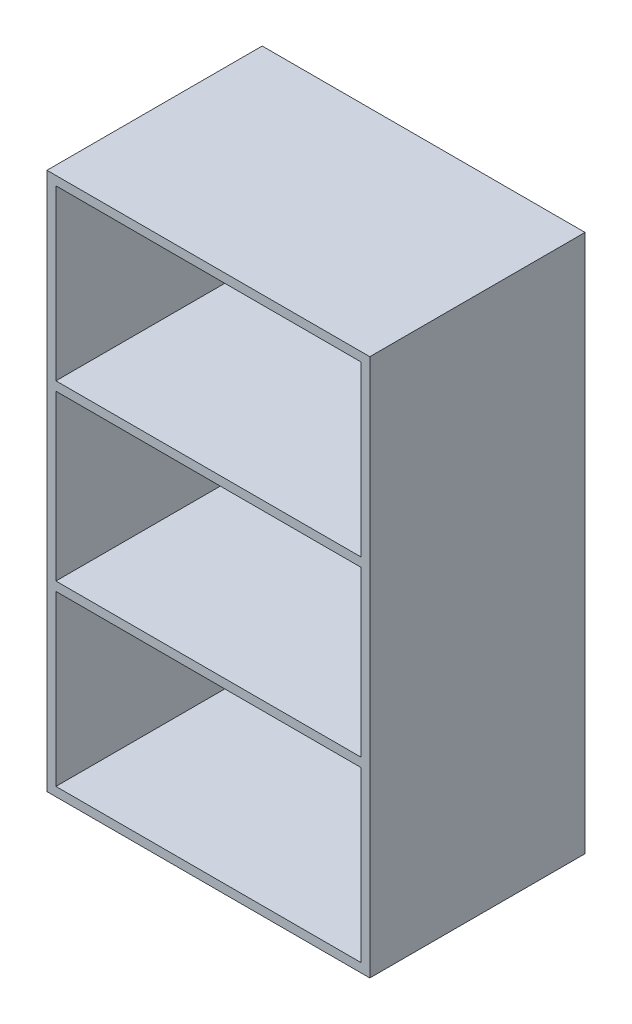
ISO-10303-21;
HEADER;
FILE_DESCRIPTION(('STEP AP214'),'2;1');
FILE_NAME('part.step','',(''),(''),'','','');
FILE_SCHEMA(('AUTOMOTIVE_DESIGN { 1 0 10303 214 1 1 1 1 }'));
ENDSEC;
DATA;
#1=APPLICATION_CONTEXT('core data for automotive mechanical design processes');
#2=APPLICATION_PROTOCOL_DEFINITION('international standard','automotive_design',2000,#1);
#3=PRODUCT_CONTEXT('',#1,'mechanical');
#4=PRODUCT('Part','Part','',(#3));
#5=PRODUCT_RELATED_PRODUCT_CATEGORY('part','',(#4));
#6=PRODUCT_DEFINITION_FORMATION('','',#4);
#7=PRODUCT_DEFINITION_CONTEXT('part definition',#1,'design');
#8=PRODUCT_DEFINITION('design','',#6,#7);
#9=PRODUCT_DEFINITION_SHAPE('','',#8);
#10=(LENGTH_UNIT() NAMED_UNIT(*) SI_UNIT(.MILLI.,.METRE.));
#11=(NAMED_UNIT(*) PLANE_ANGLE_UNIT() SI_UNIT($,.RADIAN.));
#12=(NAMED_UNIT(*) SI_UNIT($,.STERADIAN.) SOLID_ANGLE_UNIT());
#13=UNCERTAINTY_MEASURE_WITH_UNIT(LENGTH_MEASURE(1.E-05),#10,'distance_accuracy_value','');
#14=(GEOMETRIC_REPRESENTATION_CONTEXT(3) GLOBAL_UNCERTAINTY_ASSIGNED_CONTEXT((#13)) GLOBAL_UNIT_ASSIGNED_CONTEXT((#10,
#11,#12)) REPRESENTATION_CONTEXT('',''));
#15=CARTESIAN_POINT('',(0.,0.,0.));
#16=DIRECTION('',(0.,0.,1.));
#17=DIRECTION('',(1.,0.,0.));
#18=AXIS2_PLACEMENT_3D('',#15,#16,#17);
#19=CARTESIAN_POINT('',(457.2,1524.,-304.8));
#20=DIRECTION('',(-1.,0.,0.));
#21=DIRECTION('',(0.,0.,1.));
#22=AXIS2_PLACEMENT_3D('',#19,#20,#21);
#23=PLANE('',#22);
#24=DIRECTION('',(0.,0.,-1.));
#25=VECTOR('',#24,1.);
#26=CARTESIAN_POINT('',(457.2,0.,-304.8));
#27=LINE('',#26,#25);
#28=CARTESIAN_POINT('',(457.2,0.,304.8));
#29=VERTEX_POINT('',#28);
#30=CARTESIAN_POINT('',(457.2,0.,-304.8));
#31=VERTEX_POINT('',#30);
#32=EDGE_CURVE('E182',#29,#31,#27,.T.);
#33=ORIENTED_EDGE('',*,*,#32,.T.);
#34=DIRECTION('',(0.,-1.,0.));
#35=VECTOR('',#34,1.);
#36=CARTESIAN_POINT('',(457.2,1524.,-304.8));
#37=LINE('',#36,#35);
#38=CARTESIAN_POINT('',(457.2,1524.,-304.8));
#39=VERTEX_POINT('',#38);
#40=EDGE_CURVE('E11',#39,#31,#37,.T.);
#41=ORIENTED_EDGE('',*,*,#40,.F.);
#42=DIRECTION('',(0.,0.,-1.));
#43=VECTOR('',#42,1.);
#44=CARTESIAN_POINT('',(457.2,1524.,-304.8));
#45=LINE('',#44,#43);
#46=CARTESIAN_POINT('',(457.2,1524.,304.8));
#47=VERTEX_POINT('',#46);
#48=EDGE_CURVE('E247',#47,#39,#45,.T.);
#49=ORIENTED_EDGE('',*,*,#48,.F.);
#50=DIRECTION('',(0.,-1.,0.));
#51=VECTOR('',#50,1.);
#52=CARTESIAN_POINT('',(457.2,1524.,304.8));
#53=LINE('',#52,#51);
#54=EDGE_CURVE('E257',#47,#29,#53,.T.);
#55=ORIENTED_EDGE('',*,*,#54,.T.);
#56=EDGE_LOOP('',(#33,#41,#49,#55));
#57=FACE_BOUND('',#56,.T.);
#58=ADVANCED_FACE('F32',(#57),#23,.F.);
#59=CARTESIAN_POINT('',(-457.2,1524.,-304.8));
#60=DIRECTION('',(0.,0.,1.));
#61=DIRECTION('',(1.,0.,0.));
#62=AXIS2_PLACEMENT_3D('',#59,#60,#61);
#63=PLANE('',#62);
#64=DIRECTION('',(-1.,0.,0.));
#65=VECTOR('',#64,1.);
#66=CARTESIAN_POINT('',(-431.8,503.766666666667,-304.8));
#67=LINE('',#66,#65);
#68=CARTESIAN_POINT('',(431.8,503.766666666667,-304.8));
#69=VERTEX_POINT('',#68);
#70=CARTESIAN_POINT('',(-431.8,503.766666666667,-304.8));
#71=VERTEX_POINT('',#70);
#72=EDGE_CURVE('E156',#69,#71,#67,.T.);
#73=ORIENTED_EDGE('',*,*,#72,.T.);
#74=DIRECTION('',(0.,-1.,0.));
#75=VECTOR('',#74,1.);
#76=CARTESIAN_POINT('',(-431.8,503.766666666667,-304.8));
#77=LINE('',#76,#75);
#78=CARTESIAN_POINT('',(-431.8,25.4,-304.8));
#79=VERTEX_POINT('',#78);
#80=EDGE_CURVE('E148',#71,#79,#77,.T.);
#81=ORIENTED_EDGE('',*,*,#80,.T.);
#82=DIRECTION('',(1.,0.,0.));
#83=VECTOR('',#82,1.);
#84=CARTESIAN_POINT('',(-431.8,25.4,-304.8));
#85=LINE('',#84,#83);
#86=CARTESIAN_POINT('',(431.8,25.4000000000001,-304.8));
#87=VERTEX_POINT('',#86);
#88=EDGE_CURVE('E159',#79,#87,#85,.T.);
#89=ORIENTED_EDGE('',*,*,#88,.T.);
#90=DIRECTION('',(0.,1.,0.));
#91=VECTOR('',#90,1.);
#92=CARTESIAN_POINT('',(431.8,25.4000000000001,-304.8));
#93=LINE('',#92,#91);
#94=EDGE_CURVE('E46',#87,#69,#93,.T.);
#95=ORIENTED_EDGE('',*,*,#94,.T.);
#96=EDGE_LOOP('',(#73,#81,#89,#95));
#97=FACE_BOUND('',#96,.T.);
#98=DIRECTION('',(1.,0.,0.));
#99=VECTOR('',#98,1.);
#100=CARTESIAN_POINT('',(-431.8,1020.23333333333,-304.8));
#101=LINE('',#100,#99);
#102=CARTESIAN_POINT('',(-431.8,1020.23333333333,-304.8));
#103=VERTEX_POINT('',#102);
#104=CARTESIAN_POINT('',(431.8,1020.23333333333,-304.8));
#105=VERTEX_POINT('',#104);
#106=EDGE_CURVE('E194',#103,#105,#101,.T.);
#107=ORIENTED_EDGE('',*,*,#106,.T.);
#108=DIRECTION('',(0.,1.,0.));
#109=VECTOR('',#108,1.);
#110=CARTESIAN_POINT('',(431.8,1020.23333333333,-304.8));
#111=LINE('',#110,#109);
#112=CARTESIAN_POINT('',(431.8,1498.6,-304.8));
#113=VERTEX_POINT('',#112);
#114=EDGE_CURVE('E186',#105,#113,#111,.T.);
#115=ORIENTED_EDGE('',*,*,#114,.T.);
#116=DIRECTION('',(-1.,0.,0.));
#117=VECTOR('',#116,1.);
#118=CARTESIAN_POINT('',(431.8,1498.6,-304.8));
#119=LINE('',#118,#117);
#120=CARTESIAN_POINT('',(-431.8,1498.6,-304.8));
#121=VERTEX_POINT('',#120);
#122=EDGE_CURVE('E189',#113,#121,#119,.T.);
#123=ORIENTED_EDGE('',*,*,#122,.T.);
#124=DIRECTION('',(0.,-1.,0.));
#125=VECTOR('',#124,1.);
#126=CARTESIAN_POINT('',(-431.8,1498.6,-304.8));
#127=LINE('',#126,#125);
#128=EDGE_CURVE('E54',#121,#103,#127,.T.);
#129=ORIENTED_EDGE('',*,*,#128,.T.);
#130=EDGE_LOOP('',(#107,#115,#123,#129));
#131=FACE_BOUND('',#130,.T.);
#132=DIRECTION('',(-1.,0.,0.));
#133=VECTOR('',#132,1.);
#134=CARTESIAN_POINT('',(-431.8,994.833333333333,-304.8));
#135=LINE('',#134,#133);
#136=CARTESIAN_POINT('',(431.8,994.833333333333,-304.8));
#137=VERTEX_POINT('',#136);
#138=CARTESIAN_POINT('',(-431.8,994.833333333333,-304.8));
#139=VERTEX_POINT('',#138);
#140=EDGE_CURVE('E226',#137,#139,#135,.T.);
#141=ORIENTED_EDGE('',*,*,#140,.T.);
#142=DIRECTION('',(0.,-1.,0.));
#143=VECTOR('',#142,1.);
#144=CARTESIAN_POINT('',(-431.8,994.833333333333,-304.8));
#145=LINE('',#144,#143);
#146=CARTESIAN_POINT('',(-431.8,529.166666666667,-304.8));
#147=VERTEX_POINT('',#146);
#148=EDGE_CURVE('E216',#139,#147,#145,.T.);
#149=ORIENTED_EDGE('',*,*,#148,.T.);
#150=DIRECTION('',(1.,0.,0.));
#151=VECTOR('',#150,1.);
#152=CARTESIAN_POINT('',(-431.8,529.166666666667,-304.8));
#153=LINE('',#152,#151);
#154=CARTESIAN_POINT('',(431.8,529.166666666667,-304.8));
#155=VERTEX_POINT('',#154);
#156=EDGE_CURVE('E219',#147,#155,#153,.T.);
#157=ORIENTED_EDGE('',*,*,#156,.T.);
#158=DIRECTION('',(0.,1.,0.));
#159=VECTOR('',#158,1.);
#160=CARTESIAN_POINT('',(431.8,529.166666666667,-304.8));
#161=LINE('',#160,#159);
#162=EDGE_CURVE('E223',#155,#137,#161,.T.);
#163=ORIENTED_EDGE('',*,*,#162,.T.);
#164=EDGE_LOOP('',(#141,#149,#157,#163));
#165=FACE_BOUND('',#164,.T.);
#166=DIRECTION('',(-1.,0.,0.));
#167=VECTOR('',#166,1.);
#168=CARTESIAN_POINT('',(-457.2,0.,-304.8));
#169=LINE('',#168,#167);
#170=CARTESIAN_POINT('',(-457.2,0.,-304.8));
#171=VERTEX_POINT('',#170);
#172=EDGE_CURVE('E260',#31,#171,#169,.T.);
#173=ORIENTED_EDGE('',*,*,#172,.T.);
#174=DIRECTION('',(0.,-1.,0.));
#175=VECTOR('',#174,1.);
#176=CARTESIAN_POINT('',(-457.2,1524.,-304.8));
#177=LINE('',#176,#175);
#178=CARTESIAN_POINT('',(-457.2,1524.,-304.8));
#179=VERTEX_POINT('',#178);
#180=EDGE_CURVE('E39',#179,#171,#177,.T.);
#181=ORIENTED_EDGE('',*,*,#180,.F.);
#182=DIRECTION('',(-1.,0.,0.));
#183=VECTOR('',#182,1.);
#184=CARTESIAN_POINT('',(-457.2,1524.,-304.8));
#185=LINE('',#184,#183);
#186=EDGE_CURVE('E250',#39,#179,#185,.T.);
#187=ORIENTED_EDGE('',*,*,#186,.F.);
#188=ORIENTED_EDGE('',*,*,#40,.T.);
#189=EDGE_LOOP('',(#173,#181,#187,#188));
#190=FACE_BOUND('',#189,.T.);
#191=ADVANCED_FACE('F163',(#97,#131,#165,#190),#63,.F.);
#192=CARTESIAN_POINT('',(-457.2,1524.,-304.8));
#193=DIRECTION('',(1.,0.,0.));
#194=DIRECTION('',(0.,0.,-1.));
#195=AXIS2_PLACEMENT_3D('',#192,#193,#194);
#196=PLANE('',#195);
#197=DIRECTION('',(0.,0.,1.));
#198=VECTOR('',#197,1.);
#199=CARTESIAN_POINT('',(-457.2,0.,-304.8));
#200=LINE('',#199,#198);
#201=CARTESIAN_POINT('',(-457.2,0.,304.8));
#202=VERTEX_POINT('',#201);
#203=EDGE_CURVE('E262',#171,#202,#200,.T.);
#204=ORIENTED_EDGE('',*,*,#203,.T.);
#205=DIRECTION('',(0.,-1.,0.));
#206=VECTOR('',#205,1.);
#207=CARTESIAN_POINT('',(-457.2,1524.,304.8));
#208=LINE('',#207,#206);
#209=CARTESIAN_POINT('',(-457.2,1524.,304.8));
#210=VERTEX_POINT('',#209);
#211=EDGE_CURVE('E267',#210,#202,#208,.T.);
#212=ORIENTED_EDGE('',*,*,#211,.F.);
#213=DIRECTION('',(0.,0.,1.));
#214=VECTOR('',#213,1.);
#215=CARTESIAN_POINT('',(-457.2,1524.,-304.8));
#216=LINE('',#215,#214);
#217=EDGE_CURVE('E253',#179,#210,#216,.T.);
#218=ORIENTED_EDGE('',*,*,#217,.F.);
#219=ORIENTED_EDGE('',*,*,#180,.T.);
#220=EDGE_LOOP('',(#204,#212,#218,#219));
#221=FACE_BOUND('',#220,.T.);
#222=ADVANCED_FACE('F274',(#221),#196,.F.);
#223=CARTESIAN_POINT('',(-457.2,1524.,304.8));
#224=DIRECTION('',(0.,0.,-1.));
#225=DIRECTION('',(-1.,0.,0.));
#226=AXIS2_PLACEMENT_3D('',#223,#224,#225);
#227=PLANE('',#226);
#228=DIRECTION('',(1.,0.,0.));
#229=VECTOR('',#228,1.);
#230=CARTESIAN_POINT('',(-431.8,25.4,304.8));
#231=LINE('',#230,#229);
#232=CARTESIAN_POINT('',(-431.8,25.4000000000001,304.8));
#233=VERTEX_POINT('',#232);
#234=CARTESIAN_POINT('',(431.8,25.4000000000001,304.8));
#235=VERTEX_POINT('',#234);
#236=EDGE_CURVE('E175',#233,#235,#231,.T.);
#237=ORIENTED_EDGE('',*,*,#236,.F.);
#238=DIRECTION('',(0.,-1.,0.));
#239=VECTOR('',#238,1.);
#240=CARTESIAN_POINT('',(-431.8,503.766666666667,304.8));
#241=LINE('',#240,#239);
#242=CARTESIAN_POINT('',(-431.8,503.766666666667,304.8));
#243=VERTEX_POINT('',#242);
#244=EDGE_CURVE('E151',#243,#233,#241,.T.);
#245=ORIENTED_EDGE('',*,*,#244,.F.);
#246=DIRECTION('',(-1.,0.,0.));
#247=VECTOR('',#246,1.);
#248=CARTESIAN_POINT('',(-431.8,503.766666666667,304.8));
#249=LINE('',#248,#247);
#250=CARTESIAN_POINT('',(431.8,503.766666666667,304.8));
#251=VERTEX_POINT('',#250);
#252=EDGE_CURVE('E166',#251,#243,#249,.T.);
#253=ORIENTED_EDGE('',*,*,#252,.F.);
#254=DIRECTION('',(0.,1.,0.));
#255=VECTOR('',#254,1.);
#256=CARTESIAN_POINT('',(431.8,25.4000000000001,304.8));
#257=LINE('',#256,#255);
#258=EDGE_CURVE('E169',#235,#251,#257,.T.);
#259=ORIENTED_EDGE('',*,*,#258,.F.);
#260=EDGE_LOOP('',(#237,#245,#253,#259));
#261=FACE_BOUND('',#260,.T.);
#262=DIRECTION('',(-1.,0.,0.));
#263=VECTOR('',#262,1.);
#264=CARTESIAN_POINT('',(431.8,1498.6,304.8));
#265=LINE('',#264,#263);
#266=CARTESIAN_POINT('',(431.8,1498.6,304.8));
#267=VERTEX_POINT('',#266);
#268=CARTESIAN_POINT('',(-431.8,1498.6,304.8));
#269=VERTEX_POINT('',#268);
#270=EDGE_CURVE('E200',#267,#269,#265,.T.);
#271=ORIENTED_EDGE('',*,*,#270,.F.);
#272=DIRECTION('',(0.,1.,0.));
#273=VECTOR('',#272,1.);
#274=CARTESIAN_POINT('',(431.8,1020.23333333333,304.8));
#275=LINE('',#274,#273);
#276=CARTESIAN_POINT('',(431.8,1020.23333333333,304.8));
#277=VERTEX_POINT('',#276);
#278=EDGE_CURVE('E198',#277,#267,#275,.T.);
#279=ORIENTED_EDGE('',*,*,#278,.F.);
#280=DIRECTION('',(1.,0.,0.));
#281=VECTOR('',#280,1.);
#282=CARTESIAN_POINT('',(-431.8,1020.23333333333,304.8));
#283=LINE('',#282,#281);
#284=CARTESIAN_POINT('',(-431.8,1020.23333333333,304.8));
#285=VERTEX_POINT('',#284);
#286=EDGE_CURVE('E190',#285,#277,#283,.T.);
#287=ORIENTED_EDGE('',*,*,#286,.F.);
#288=DIRECTION('',(0.,-1.,0.));
#289=VECTOR('',#288,1.);
#290=CARTESIAN_POINT('',(-431.8,1498.6,304.8));
#291=LINE('',#290,#289);
#292=EDGE_CURVE('E204',#269,#285,#291,.T.);
#293=ORIENTED_EDGE('',*,*,#292,.F.);
#294=EDGE_LOOP('',(#271,#279,#287,#293));
#295=FACE_BOUND('',#294,.T.);
#296=DIRECTION('',(1.,0.,0.));
#297=VECTOR('',#296,1.);
#298=CARTESIAN_POINT('',(-431.8,529.166666666667,304.8));
#299=LINE('',#298,#297);
#300=CARTESIAN_POINT('',(-431.8,529.166666666667,304.8));
#301=VERTEX_POINT('',#300);
#302=CARTESIAN_POINT('',(431.8,529.166666666667,304.8));
#303=VERTEX_POINT('',#302);
#304=EDGE_CURVE('E232',#301,#303,#299,.T.);
#305=ORIENTED_EDGE('',*,*,#304,.F.);
#306=DIRECTION('',(0.,-1.,0.));
#307=VECTOR('',#306,1.);
#308=CARTESIAN_POINT('',(-431.8,994.833333333333,304.8));
#309=LINE('',#308,#307);
#310=CARTESIAN_POINT('',(-431.8,994.833333333333,304.8));
#311=VERTEX_POINT('',#310);
#312=EDGE_CURVE('E230',#311,#301,#309,.T.);
#313=ORIENTED_EDGE('',*,*,#312,.F.);
#314=DIRECTION('',(-1.,0.,0.));
#315=VECTOR('',#314,1.);
#316=CARTESIAN_POINT('',(-431.8,994.833333333333,304.8));
#317=LINE('',#316,#315);
#318=CARTESIAN_POINT('',(431.8,994.833333333333,304.8));
#319=VERTEX_POINT('',#318);
#320=EDGE_CURVE('E220',#319,#311,#317,.T.);
#321=ORIENTED_EDGE('',*,*,#320,.F.);
#322=DIRECTION('',(0.,1.,0.));
#323=VECTOR('',#322,1.);
#324=CARTESIAN_POINT('',(431.8,529.166666666667,304.8));
#325=LINE('',#324,#323);
#326=EDGE_CURVE('E235',#303,#319,#325,.T.);
#327=ORIENTED_EDGE('',*,*,#326,.F.);
#328=EDGE_LOOP('',(#305,#313,#321,#327));
#329=FACE_BOUND('',#328,.T.);
#330=DIRECTION('',(1.,0.,0.));
#331=VECTOR('',#330,1.);
#332=CARTESIAN_POINT('',(-457.2,0.,304.8));
#333=LINE('',#332,#331);
#334=EDGE_CURVE('E251',#202,#29,#333,.T.);
#335=ORIENTED_EDGE('',*,*,#334,.T.);
#336=ORIENTED_EDGE('',*,*,#54,.F.);
#337=DIRECTION('',(1.,0.,0.));
#338=VECTOR('',#337,1.);
#339=CARTESIAN_POINT('',(-457.2,1524.,304.8));
#340=LINE('',#339,#338);
#341=EDGE_CURVE('E255',#210,#47,#340,.T.);
#342=ORIENTED_EDGE('',*,*,#341,.F.);
#343=ORIENTED_EDGE('',*,*,#211,.T.);
#344=EDGE_LOOP('',(#335,#336,#342,#343));
#345=FACE_BOUND('',#344,.T.);
#346=ADVANCED_FACE('F283',(#261,#295,#329,#345),#227,.F.);
#347=CARTESIAN_POINT('',(0.,1524.,0.));
#348=DIRECTION('',(0.,1.,0.));
#349=DIRECTION('',(0.,0.,1.));
#350=AXIS2_PLACEMENT_3D('',#347,#348,#349);
#351=PLANE('',#350);
#352=ORIENTED_EDGE('',*,*,#48,.T.);
#353=ORIENTED_EDGE('',*,*,#186,.T.);
#354=ORIENTED_EDGE('',*,*,#217,.T.);
#355=ORIENTED_EDGE('',*,*,#341,.T.);
#356=EDGE_LOOP('',(#352,#353,#354,#355));
#357=FACE_BOUND('',#356,.T.);
#358=ADVANCED_FACE('F289',(#357),#351,.T.);
#359=CARTESIAN_POINT('',(0.,0.,0.));
#360=DIRECTION('',(0.,1.,0.));
#361=DIRECTION('',(0.,0.,1.));
#362=AXIS2_PLACEMENT_3D('',#359,#360,#361);
#363=PLANE('',#362);
#364=ORIENTED_EDGE('',*,*,#32,.F.);
#365=ORIENTED_EDGE('',*,*,#334,.F.);
#366=ORIENTED_EDGE('',*,*,#203,.F.);
#367=ORIENTED_EDGE('',*,*,#172,.F.);
#368=EDGE_LOOP('',(#364,#365,#366,#367));
#369=FACE_BOUND('',#368,.T.);
#370=ADVANCED_FACE('F280',(#369),#363,.F.);
#371=CARTESIAN_POINT('',(-431.8,994.833333333333,-304.8));
#372=DIRECTION('',(-1.,0.,0.));
#373=DIRECTION('',(0.,-1.,0.));
#374=AXIS2_PLACEMENT_3D('',#371,#372,#373);
#375=PLANE('',#374);
#376=ORIENTED_EDGE('',*,*,#312,.T.);
#377=DIRECTION('',(0.,0.,1.));
#378=VECTOR('',#377,1.);
#379=CARTESIAN_POINT('',(-431.8,529.166666666667,-304.8));
#380=LINE('',#379,#378);
#381=EDGE_CURVE('E229',#147,#301,#380,.T.);
#382=ORIENTED_EDGE('',*,*,#381,.F.);
#383=ORIENTED_EDGE('',*,*,#148,.F.);
#384=DIRECTION('',(0.,0.,1.));
#385=VECTOR('',#384,1.);
#386=CARTESIAN_POINT('',(-431.8,994.833333333333,-304.8));
#387=LINE('',#386,#385);
#388=EDGE_CURVE('E201',#139,#311,#387,.T.);
#389=ORIENTED_EDGE('',*,*,#388,.T.);
#390=EDGE_LOOP('',(#376,#382,#383,#389));
#391=FACE_BOUND('',#390,.T.);
#392=ADVANCED_FACE('F302',(#391),#375,.F.);
#393=CARTESIAN_POINT('',(-431.8,994.833333333333,-304.8));
#394=DIRECTION('',(0.,1.,0.));
#395=DIRECTION('',(0.,0.,1.));
#396=AXIS2_PLACEMENT_3D('',#393,#394,#395);
#397=PLANE('',#396);
#398=ORIENTED_EDGE('',*,*,#320,.T.);
#399=ORIENTED_EDGE('',*,*,#388,.F.);
#400=ORIENTED_EDGE('',*,*,#140,.F.);
#401=DIRECTION('',(0.,0.,1.));
#402=VECTOR('',#401,1.);
#403=CARTESIAN_POINT('',(431.8,994.833333333333,-304.8));
#404=LINE('',#403,#402);
#405=EDGE_CURVE('E241',#137,#319,#404,.T.);
#406=ORIENTED_EDGE('',*,*,#405,.T.);
#407=EDGE_LOOP('',(#398,#399,#400,#406));
#408=FACE_BOUND('',#407,.T.);
#409=ADVANCED_FACE('F307',(#408),#397,.F.);
#410=CARTESIAN_POINT('',(431.8,529.166666666667,-304.8));
#411=DIRECTION('',(1.,0.,0.));
#412=DIRECTION('',(0.,0.,-1.));
#413=AXIS2_PLACEMENT_3D('',#410,#411,#412);
#414=PLANE('',#413);
#415=ORIENTED_EDGE('',*,*,#326,.T.);
#416=ORIENTED_EDGE('',*,*,#405,.F.);
#417=ORIENTED_EDGE('',*,*,#162,.F.);
#418=DIRECTION('',(0.,0.,1.));
#419=VECTOR('',#418,1.);
#420=CARTESIAN_POINT('',(431.8,529.166666666667,-304.8));
#421=LINE('',#420,#419);
#422=EDGE_CURVE('E243',#155,#303,#421,.T.);
#423=ORIENTED_EDGE('',*,*,#422,.T.);
#424=EDGE_LOOP('',(#415,#416,#417,#423));
#425=FACE_BOUND('',#424,.T.);
#426=ADVANCED_FACE('F313',(#425),#414,.F.);
#427=CARTESIAN_POINT('',(-431.8,529.166666666667,-304.8));
#428=DIRECTION('',(0.,-1.,0.));
#429=DIRECTION('',(0.,0.,-1.));
#430=AXIS2_PLACEMENT_3D('',#427,#428,#429);
#431=PLANE('',#430);
#432=ORIENTED_EDGE('',*,*,#304,.T.);
#433=ORIENTED_EDGE('',*,*,#422,.F.);
#434=ORIENTED_EDGE('',*,*,#156,.F.);
#435=ORIENTED_EDGE('',*,*,#381,.T.);
#436=EDGE_LOOP('',(#432,#433,#434,#435));
#437=FACE_BOUND('',#436,.T.);
#438=ADVANCED_FACE('F309',(#437),#431,.F.);
#439=CARTESIAN_POINT('',(431.8,1020.23333333333,-304.8));
#440=DIRECTION('',(1.,0.,0.));
#441=DIRECTION('',(0.,0.,-1.));
#442=AXIS2_PLACEMENT_3D('',#439,#440,#441);
#443=PLANE('',#442);
#444=ORIENTED_EDGE('',*,*,#278,.T.);
#445=DIRECTION('',(0.,0.,1.));
#446=VECTOR('',#445,1.);
#447=CARTESIAN_POINT('',(431.8,1498.6,-304.8));
#448=LINE('',#447,#446);
#449=EDGE_CURVE('E197',#113,#267,#448,.T.);
#450=ORIENTED_EDGE('',*,*,#449,.F.);
#451=ORIENTED_EDGE('',*,*,#114,.F.);
#452=DIRECTION('',(0.,0.,1.));
#453=VECTOR('',#452,1.);
#454=CARTESIAN_POINT('',(431.8,1020.23333333333,-304.8));
#455=LINE('',#454,#453);
#456=EDGE_CURVE('E176',#105,#277,#455,.T.);
#457=ORIENTED_EDGE('',*,*,#456,.T.);
#458=EDGE_LOOP('',(#444,#450,#451,#457));
#459=FACE_BOUND('',#458,.T.);
#460=ADVANCED_FACE('F312',(#459),#443,.F.);
#461=CARTESIAN_POINT('',(-431.8,1020.23333333333,-304.8));
#462=DIRECTION('',(0.,-1.,0.));
#463=DIRECTION('',(0.,0.,-1.));
#464=AXIS2_PLACEMENT_3D('',#461,#462,#463);
#465=PLANE('',#464);
#466=ORIENTED_EDGE('',*,*,#286,.T.);
#467=ORIENTED_EDGE('',*,*,#456,.F.);
#468=ORIENTED_EDGE('',*,*,#106,.F.);
#469=DIRECTION('',(0.,0.,1.));
#470=VECTOR('',#469,1.);
#471=CARTESIAN_POINT('',(-431.8,1020.23333333333,-304.8));
#472=LINE('',#471,#470);
#473=EDGE_CURVE('E210',#103,#285,#472,.T.);
#474=ORIENTED_EDGE('',*,*,#473,.T.);
#475=EDGE_LOOP('',(#466,#467,#468,#474));
#476=FACE_BOUND('',#475,.T.);
#477=ADVANCED_FACE('F323',(#476),#465,.F.);
#478=CARTESIAN_POINT('',(-431.8,1498.6,-304.8));
#479=DIRECTION('',(-1.,0.,0.));
#480=DIRECTION('',(0.,0.,1.));
#481=AXIS2_PLACEMENT_3D('',#478,#479,#480);
#482=PLANE('',#481);
#483=ORIENTED_EDGE('',*,*,#292,.T.);
#484=ORIENTED_EDGE('',*,*,#473,.F.);
#485=ORIENTED_EDGE('',*,*,#128,.F.);
#486=DIRECTION('',(0.,0.,1.));
#487=VECTOR('',#486,1.);
#488=CARTESIAN_POINT('',(-431.8,1498.6,-304.8));
#489=LINE('',#488,#487);
#490=EDGE_CURVE('E212',#121,#269,#489,.T.);
#491=ORIENTED_EDGE('',*,*,#490,.T.);
#492=EDGE_LOOP('',(#483,#484,#485,#491));
#493=FACE_BOUND('',#492,.T.);
#494=ADVANCED_FACE('F328',(#493),#482,.F.);
#495=CARTESIAN_POINT('',(431.8,1498.6,-304.8));
#496=DIRECTION('',(0.,1.,0.));
#497=DIRECTION('',(-1.,0.,0.));
#498=AXIS2_PLACEMENT_3D('',#495,#496,#497);
#499=PLANE('',#498);
#500=ORIENTED_EDGE('',*,*,#270,.T.);
#501=ORIENTED_EDGE('',*,*,#490,.F.);
#502=ORIENTED_EDGE('',*,*,#122,.F.);
#503=ORIENTED_EDGE('',*,*,#449,.T.);
#504=EDGE_LOOP('',(#500,#501,#502,#503));
#505=FACE_BOUND('',#504,.T.);
#506=ADVANCED_FACE('F325',(#505),#499,.F.);
#507=CARTESIAN_POINT('',(-431.8,503.766666666667,-304.8));
#508=DIRECTION('',(-1.,0.,0.));
#509=DIRECTION('',(0.,-1.,0.));
#510=AXIS2_PLACEMENT_3D('',#507,#508,#509);
#511=PLANE('',#510);
#512=ORIENTED_EDGE('',*,*,#244,.T.);
#513=DIRECTION('',(0.,0.,1.));
#514=VECTOR('',#513,1.);
#515=CARTESIAN_POINT('',(-431.8,25.4,-304.8));
#516=LINE('',#515,#514);
#517=EDGE_CURVE('E144',#79,#233,#516,.T.);
#518=ORIENTED_EDGE('',*,*,#517,.F.);
#519=ORIENTED_EDGE('',*,*,#80,.F.);
#520=DIRECTION('',(0.,0.,1.));
#521=VECTOR('',#520,1.);
#522=CARTESIAN_POINT('',(-431.8,503.766666666667,-304.8));
#523=LINE('',#522,#521);
#524=EDGE_CURVE('E180',#71,#243,#523,.T.);
#525=ORIENTED_EDGE('',*,*,#524,.T.);
#526=EDGE_LOOP('',(#512,#518,#519,#525));
#527=FACE_BOUND('',#526,.T.);
#528=ADVANCED_FACE('F146',(#527),#511,.F.);
#529=CARTESIAN_POINT('',(-431.8,503.766666666667,-304.8));
#530=DIRECTION('',(0.,1.,0.));
#531=DIRECTION('',(0.,0.,1.));
#532=AXIS2_PLACEMENT_3D('',#529,#530,#531);
#533=PLANE('',#532);
#534=ORIENTED_EDGE('',*,*,#252,.T.);
#535=ORIENTED_EDGE('',*,*,#524,.F.);
#536=ORIENTED_EDGE('',*,*,#72,.F.);
#537=DIRECTION('',(0.,0.,1.));
#538=VECTOR('',#537,1.);
#539=CARTESIAN_POINT('',(431.8,503.766666666667,-304.8));
#540=LINE('',#539,#538);
#541=EDGE_CURVE('E183',#69,#251,#540,.T.);
#542=ORIENTED_EDGE('',*,*,#541,.T.);
#543=EDGE_LOOP('',(#534,#535,#536,#542));
#544=FACE_BOUND('',#543,.T.);
#545=ADVANCED_FACE('F337',(#544),#533,.F.);
#546=CARTESIAN_POINT('',(431.8,25.4000000000001,-304.8));
#547=DIRECTION('',(1.,0.,0.));
#548=DIRECTION('',(0.,0.,-1.));
#549=AXIS2_PLACEMENT_3D('',#546,#547,#548);
#550=PLANE('',#549);
#551=ORIENTED_EDGE('',*,*,#258,.T.);
#552=ORIENTED_EDGE('',*,*,#541,.F.);
#553=ORIENTED_EDGE('',*,*,#94,.F.);
#554=DIRECTION('',(0.,0.,1.));
#555=VECTOR('',#554,1.);
#556=CARTESIAN_POINT('',(431.8,25.4000000000001,-304.8));
#557=LINE('',#556,#555);
#558=EDGE_CURVE('E155',#87,#235,#557,.T.);
#559=ORIENTED_EDGE('',*,*,#558,.T.);
#560=EDGE_LOOP('',(#551,#552,#553,#559));
#561=FACE_BOUND('',#560,.T.);
#562=ADVANCED_FACE('F340',(#561),#550,.F.);
#563=CARTESIAN_POINT('',(-431.8,25.4,-304.8));
#564=DIRECTION('',(0.,-1.,0.));
#565=DIRECTION('',(1.,0.,0.));
#566=AXIS2_PLACEMENT_3D('',#563,#564,#565);
#567=PLANE('',#566);
#568=ORIENTED_EDGE('',*,*,#236,.T.);
#569=ORIENTED_EDGE('',*,*,#558,.F.);
#570=ORIENTED_EDGE('',*,*,#88,.F.);
#571=ORIENTED_EDGE('',*,*,#517,.T.);
#572=EDGE_LOOP('',(#568,#569,#570,#571));
#573=FACE_BOUND('',#572,.T.);
#574=ADVANCED_FACE('F160',(#573),#567,.F.);
#575=CLOSED_SHELL('',(#58,#191,#222,#346,#358,#370,#392,#409,#426,#438,#460,#477,#494,#506,#528,
#545,#562,#574));
#576=MANIFOLD_SOLID_BREP('B2',#575);
#577=ADVANCED_BREP_SHAPE_REPRESENTATION('',(#18,#576),#14);
#578=SHAPE_DEFINITION_REPRESENTATION(#9,#577);
ENDSEC;
END-ISO-10303-21;
